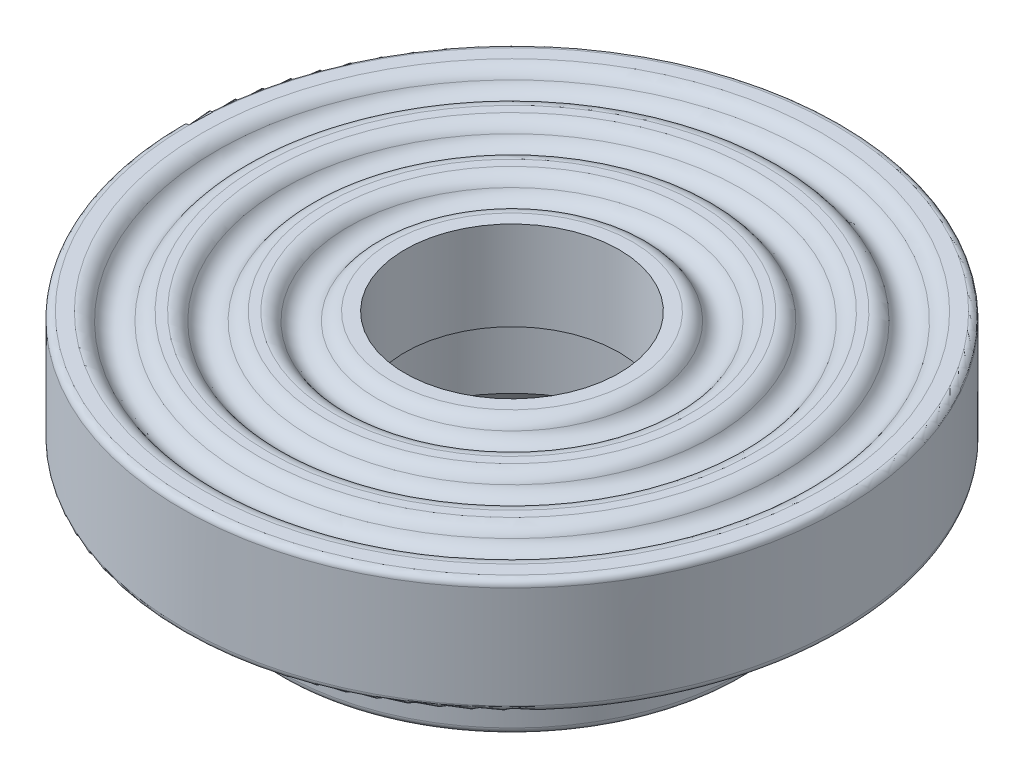
ISO-10303-21;
HEADER;
FILE_DESCRIPTION(('STEP AP214'),'2;1');
FILE_NAME('part.step','',(''),(''),'','','');
FILE_SCHEMA(('AUTOMOTIVE_DESIGN { 1 0 10303 214 1 1 1 1 }'));
ENDSEC;
DATA;
#1=APPLICATION_CONTEXT('core data for automotive mechanical design processes');
#2=APPLICATION_PROTOCOL_DEFINITION('international standard','automotive_design',2000,#1);
#3=PRODUCT_CONTEXT('',#1,'mechanical');
#4=PRODUCT('Part','Part','',(#3));
#5=PRODUCT_RELATED_PRODUCT_CATEGORY('part','',(#4));
#6=PRODUCT_DEFINITION_FORMATION('','',#4);
#7=PRODUCT_DEFINITION_CONTEXT('part definition',#1,'design');
#8=PRODUCT_DEFINITION('design','',#6,#7);
#9=PRODUCT_DEFINITION_SHAPE('','',#8);
#10=(LENGTH_UNIT() NAMED_UNIT(*) SI_UNIT(.MILLI.,.METRE.));
#11=(NAMED_UNIT(*) PLANE_ANGLE_UNIT() SI_UNIT($,.RADIAN.));
#12=(NAMED_UNIT(*) SI_UNIT($,.STERADIAN.) SOLID_ANGLE_UNIT());
#13=UNCERTAINTY_MEASURE_WITH_UNIT(LENGTH_MEASURE(1.E-05),#10,'distance_accuracy_value','');
#14=(GEOMETRIC_REPRESENTATION_CONTEXT(3) GLOBAL_UNCERTAINTY_ASSIGNED_CONTEXT((#13)) GLOBAL_UNIT_ASSIGNED_CONTEXT((#10,
#11,#12)) REPRESENTATION_CONTEXT('',''));
#15=CARTESIAN_POINT('',(0.,0.,0.));
#16=DIRECTION('',(0.,0.,1.));
#17=DIRECTION('',(1.,0.,0.));
#18=AXIS2_PLACEMENT_3D('',#15,#16,#17);
#19=CARTESIAN_POINT('',(0.,5.7,0.));
#20=DIRECTION('',(0.,-1.,0.));
#21=DIRECTION('',(0.,0.,-1.));
#22=AXIS2_PLACEMENT_3D('',#19,#20,#21);
#23=TOROIDAL_SURFACE('',#22,5.39102540378444,0.5);
#24=CARTESIAN_POINT('',(0.,6.2,0.));
#25=DIRECTION('',(0.,1.,0.));
#26=DIRECTION('',(0.,0.,-1.));
#27=AXIS2_PLACEMENT_3D('',#24,#25,#26);
#28=CIRCLE('',#27,5.39102540378444);
#29=CARTESIAN_POINT('',(0.,6.2,-5.39102540378444));
#30=VERTEX_POINT('',#29);
#31=CARTESIAN_POINT('',(0.,6.2,5.39102540378444));
#32=VERTEX_POINT('',#31);
#33=EDGE_CURVE('E91',#30,#32,#28,.T.);
#34=ORIENTED_EDGE('',*,*,#33,.T.);
#35=CARTESIAN_POINT('',(0.,6.2,0.));
#36=DIRECTION('',(0.,1.,0.));
#37=DIRECTION('',(0.,0.,1.));
#38=AXIS2_PLACEMENT_3D('',#35,#36,#37);
#39=CIRCLE('',#38,5.39102540378444);
#40=EDGE_CURVE('E94',#32,#30,#39,.T.);
#41=ORIENTED_EDGE('',*,*,#40,.T.);
#42=EDGE_LOOP('',(#34,#41));
#43=FACE_BOUND('',#42,.T.);
#44=CARTESIAN_POINT('',(0.,5.95,0.));
#45=DIRECTION('',(0.,-1.,0.));
#46=DIRECTION('',(0.,0.,-1.));
#47=AXIS2_PLACEMENT_3D('',#44,#45,#46);
#48=CIRCLE('',#47,4.95801270189222);
#49=CARTESIAN_POINT('',(0.,5.95,-4.95801270189222));
#50=VERTEX_POINT('',#49);
#51=EDGE_CURVE('E99',#50,#50,#48,.T.);
#52=ORIENTED_EDGE('',*,*,#51,.T.);
#53=EDGE_LOOP('',(#52));
#54=FACE_BOUND('',#53,.T.);
#55=ADVANCED_FACE('F17',(#43,#54),#23,.T.);
#56=CARTESIAN_POINT('',(-3.25,6.2,0.));
#57=DIRECTION('',(0.,-1.,0.));
#58=DIRECTION('',(0.,0.,-1.));
#59=AXIS2_PLACEMENT_3D('',#56,#57,#58);
#60=PLANE('',#59);
#61=CARTESIAN_POINT('',(0.,6.2,0.));
#62=DIRECTION('',(0.,-1.,0.));
#63=DIRECTION('',(0.,0.,1.));
#64=AXIS2_PLACEMENT_3D('',#61,#62,#63);
#65=CIRCLE('',#64,5.65897459621556);
#66=CARTESIAN_POINT('',(0.,6.2,5.65897459621556));
#67=VERTEX_POINT('',#66);
#68=CARTESIAN_POINT('',(0.,6.2,-5.65897459621556));
#69=VERTEX_POINT('',#68);
#70=EDGE_CURVE('E183',#67,#69,#65,.T.);
#71=ORIENTED_EDGE('',*,*,#70,.F.);
#72=CARTESIAN_POINT('',(0.,6.2,0.));
#73=DIRECTION('',(0.,-1.,0.));
#74=DIRECTION('',(0.,0.,-1.));
#75=AXIS2_PLACEMENT_3D('',#72,#73,#74);
#76=CIRCLE('',#75,5.65897459621556);
#77=EDGE_CURVE('E136',#69,#67,#76,.T.);
#78=ORIENTED_EDGE('',*,*,#77,.F.);
#79=EDGE_LOOP('',(#71,#78));
#80=FACE_BOUND('',#79,.T.);
#81=ORIENTED_EDGE('',*,*,#33,.F.);
#82=ORIENTED_EDGE('',*,*,#40,.F.);
#83=EDGE_LOOP('',(#81,#82));
#84=FACE_BOUND('',#83,.T.);
#85=ADVANCED_FACE('F96',(#80,#84),#60,.F.);
#86=CARTESIAN_POINT('',(0.,6.2,0.));
#87=DIRECTION('',(0.,-1.,0.));
#88=DIRECTION('',(0.,0.,-1.));
#89=AXIS2_PLACEMENT_3D('',#86,#87,#88);
#90=TOROIDAL_SURFACE('',#89,4.525,0.500000000000002);
#91=ORIENTED_EDGE('',*,*,#51,.F.);
#92=EDGE_LOOP('',(#91));
#93=FACE_BOUND('',#92,.T.);
#94=CARTESIAN_POINT('',(0.,5.95,0.));
#95=DIRECTION('',(0.,1.,0.));
#96=DIRECTION('',(0.,0.,1.));
#97=AXIS2_PLACEMENT_3D('',#94,#95,#96);
#98=CIRCLE('',#97,4.09198729810778);
#99=CARTESIAN_POINT('',(0.,5.95,4.09198729810778));
#100=VERTEX_POINT('',#99);
#101=EDGE_CURVE('E134',#100,#100,#98,.T.);
#102=ORIENTED_EDGE('',*,*,#101,.F.);
#103=EDGE_LOOP('',(#102));
#104=FACE_BOUND('',#103,.T.);
#105=ADVANCED_FACE('F121',(#93,#104),#90,.F.);
#106=CARTESIAN_POINT('',(0.,5.7,0.));
#107=DIRECTION('',(0.,1.,0.));
#108=DIRECTION('',(0.,0.,1.));
#109=AXIS2_PLACEMENT_3D('',#106,#107,#108);
#110=TOROIDAL_SURFACE('',#109,5.65897459621556,0.5);
#111=ORIENTED_EDGE('',*,*,#70,.T.);
#112=ORIENTED_EDGE('',*,*,#77,.T.);
#113=EDGE_LOOP('',(#111,#112));
#114=FACE_BOUND('',#113,.T.);
#115=CARTESIAN_POINT('',(0.,5.95,0.));
#116=DIRECTION('',(0.,-1.,0.));
#117=DIRECTION('',(0.,0.,-1.));
#118=AXIS2_PLACEMENT_3D('',#115,#116,#117);
#119=CIRCLE('',#118,6.09198729810778);
#120=CARTESIAN_POINT('',(0.,5.95,-6.09198729810778));
#121=VERTEX_POINT('',#120);
#122=EDGE_CURVE('E132',#121,#121,#119,.F.);
#123=ORIENTED_EDGE('',*,*,#122,.T.);
#124=EDGE_LOOP('',(#123));
#125=FACE_BOUND('',#124,.T.);
#126=ADVANCED_FACE('F109',(#114,#125),#110,.T.);
#127=CARTESIAN_POINT('',(0.,5.7,0.));
#128=DIRECTION('',(0.,1.,0.));
#129=DIRECTION('',(0.,0.,1.));
#130=AXIS2_PLACEMENT_3D('',#127,#128,#129);
#131=TOROIDAL_SURFACE('',#130,3.65897459621556,0.5);
#132=CARTESIAN_POINT('',(0.,6.2,0.));
#133=DIRECTION('',(0.,-1.,0.));
#134=DIRECTION('',(0.,0.,1.));
#135=AXIS2_PLACEMENT_3D('',#132,#133,#134);
#136=CIRCLE('',#135,3.65897459621556);
#137=CARTESIAN_POINT('',(0.,6.2,3.65897459621556));
#138=VERTEX_POINT('',#137);
#139=CARTESIAN_POINT('',(0.,6.2,-3.65897459621556));
#140=VERTEX_POINT('',#139);
#141=EDGE_CURVE('E469',#138,#140,#136,.T.);
#142=ORIENTED_EDGE('',*,*,#141,.T.);
#143=CARTESIAN_POINT('',(0.,6.2,0.));
#144=DIRECTION('',(0.,-1.,0.));
#145=DIRECTION('',(0.,0.,-1.));
#146=AXIS2_PLACEMENT_3D('',#143,#144,#145);
#147=CIRCLE('',#146,3.65897459621556);
#148=EDGE_CURVE('E478',#140,#138,#147,.T.);
#149=ORIENTED_EDGE('',*,*,#148,.T.);
#150=EDGE_LOOP('',(#142,#149));
#151=FACE_BOUND('',#150,.T.);
#152=ORIENTED_EDGE('',*,*,#101,.T.);
#153=EDGE_LOOP('',(#152));
#154=FACE_BOUND('',#153,.T.);
#155=ADVANCED_FACE('F120',(#151,#154),#131,.T.);
#156=CARTESIAN_POINT('',(0.,6.2,0.));
#157=DIRECTION('',(0.,-1.,0.));
#158=DIRECTION('',(0.,0.,-1.));
#159=AXIS2_PLACEMENT_3D('',#156,#157,#158);
#160=TOROIDAL_SURFACE('',#159,6.525,0.500000000000001);
#161=CARTESIAN_POINT('',(0.,5.95,0.));
#162=DIRECTION('',(0.,-1.,0.));
#163=DIRECTION('',(0.,0.,-1.));
#164=AXIS2_PLACEMENT_3D('',#161,#162,#163);
#165=CIRCLE('',#164,6.95801270189222);
#166=CARTESIAN_POINT('',(0.,5.95,-6.95801270189222));
#167=VERTEX_POINT('',#166);
#168=EDGE_CURVE('E213',#167,#167,#165,.T.);
#169=ORIENTED_EDGE('',*,*,#168,.F.);
#170=EDGE_LOOP('',(#169));
#171=FACE_BOUND('',#170,.T.);
#172=ORIENTED_EDGE('',*,*,#122,.F.);
#173=EDGE_LOOP('',(#172));
#174=FACE_BOUND('',#173,.T.);
#175=ADVANCED_FACE('F485',(#171,#174),#160,.F.);
#176=CARTESIAN_POINT('',(-3.25,6.2,0.));
#177=DIRECTION('',(0.,-1.,0.));
#178=DIRECTION('',(0.,0.,-1.));
#179=AXIS2_PLACEMENT_3D('',#176,#177,#178);
#180=PLANE('',#179);
#181=CARTESIAN_POINT('',(0.,6.2,0.));
#182=DIRECTION('',(0.,-1.,0.));
#183=DIRECTION('',(0.,0.,-1.));
#184=AXIS2_PLACEMENT_3D('',#181,#182,#183);
#185=CIRCLE('',#184,3.25);
#186=CARTESIAN_POINT('',(0.,6.2,-3.25));
#187=VERTEX_POINT('',#186);
#188=EDGE_CURVE('E209',#187,#187,#185,.T.);
#189=ORIENTED_EDGE('',*,*,#188,.T.);
#190=EDGE_LOOP('',(#189));
#191=FACE_BOUND('',#190,.T.);
#192=ORIENTED_EDGE('',*,*,#141,.F.);
#193=ORIENTED_EDGE('',*,*,#148,.F.);
#194=EDGE_LOOP('',(#192,#193));
#195=FACE_BOUND('',#194,.T.);
#196=ADVANCED_FACE('F449',(#191,#195),#180,.F.);
#197=CARTESIAN_POINT('',(0.,5.7,0.));
#198=DIRECTION('',(0.,-1.,0.));
#199=DIRECTION('',(0.,0.,-1.));
#200=AXIS2_PLACEMENT_3D('',#197,#198,#199);
#201=TOROIDAL_SURFACE('',#200,7.39102540378444,0.5);
#202=CARTESIAN_POINT('',(0.,6.2,0.));
#203=DIRECTION('',(0.,1.,0.));
#204=DIRECTION('',(0.,0.,-1.));
#205=AXIS2_PLACEMENT_3D('',#202,#203,#204);
#206=CIRCLE('',#205,7.39102540378444);
#207=CARTESIAN_POINT('',(0.,6.2,-7.39102540378444));
#208=VERTEX_POINT('',#207);
#209=CARTESIAN_POINT('',(0.,6.2,7.39102540378444));
#210=VERTEX_POINT('',#209);
#211=EDGE_CURVE('E212',#208,#210,#206,.T.);
#212=ORIENTED_EDGE('',*,*,#211,.T.);
#213=CARTESIAN_POINT('',(0.,6.2,0.));
#214=DIRECTION('',(0.,1.,0.));
#215=DIRECTION('',(0.,0.,1.));
#216=AXIS2_PLACEMENT_3D('',#213,#214,#215);
#217=CIRCLE('',#216,7.39102540378444);
#218=EDGE_CURVE('E208',#210,#208,#217,.T.);
#219=ORIENTED_EDGE('',*,*,#218,.T.);
#220=EDGE_LOOP('',(#212,#219));
#221=FACE_BOUND('',#220,.T.);
#222=ORIENTED_EDGE('',*,*,#168,.T.);
#223=EDGE_LOOP('',(#222));
#224=FACE_BOUND('',#223,.T.);
#225=ADVANCED_FACE('F445',(#221,#224),#201,.T.);
#226=CARTESIAN_POINT('',(0.,0.,0.));
#227=DIRECTION('',(0.,-1.,0.));
#228=DIRECTION('',(0.,0.,-1.));
#229=AXIS2_PLACEMENT_3D('',#226,#227,#228);
#230=CYLINDRICAL_SURFACE('',#229,3.25);
#231=ORIENTED_EDGE('',*,*,#188,.F.);
#232=EDGE_LOOP('',(#231));
#233=FACE_BOUND('',#232,.T.);
#234=CARTESIAN_POINT('',(0.,3.5,0.));
#235=DIRECTION('',(0.,-1.,0.));
#236=DIRECTION('',(0.,0.,-1.));
#237=AXIS2_PLACEMENT_3D('',#234,#235,#236);
#238=CIRCLE('',#237,3.25);
#239=CARTESIAN_POINT('',(0.,3.5,-3.25));
#240=VERTEX_POINT('',#239);
#241=EDGE_CURVE('E204',#240,#240,#238,.T.);
#242=ORIENTED_EDGE('',*,*,#241,.T.);
#243=EDGE_LOOP('',(#242));
#244=FACE_BOUND('',#243,.T.);
#245=ADVANCED_FACE('F405',(#233,#244),#230,.F.);
#246=CARTESIAN_POINT('',(-3.25,6.2,0.));
#247=DIRECTION('',(0.,-1.,0.));
#248=DIRECTION('',(0.,0.,-1.));
#249=AXIS2_PLACEMENT_3D('',#246,#247,#248);
#250=PLANE('',#249);
#251=CARTESIAN_POINT('',(0.,6.2,0.));
#252=DIRECTION('',(0.,-1.,0.));
#253=DIRECTION('',(0.,0.,1.));
#254=AXIS2_PLACEMENT_3D('',#251,#252,#253);
#255=CIRCLE('',#254,7.65897459621556);
#256=CARTESIAN_POINT('',(0.,6.2,7.65897459621556));
#257=VERTEX_POINT('',#256);
#258=CARTESIAN_POINT('',(0.,6.2,-7.65897459621556));
#259=VERTEX_POINT('',#258);
#260=EDGE_CURVE('E207',#257,#259,#255,.T.);
#261=ORIENTED_EDGE('',*,*,#260,.F.);
#262=CARTESIAN_POINT('',(0.,6.2,0.));
#263=DIRECTION('',(0.,-1.,0.));
#264=DIRECTION('',(0.,0.,-1.));
#265=AXIS2_PLACEMENT_3D('',#262,#263,#264);
#266=CIRCLE('',#265,7.65897459621556);
#267=EDGE_CURVE('E203',#259,#257,#266,.T.);
#268=ORIENTED_EDGE('',*,*,#267,.F.);
#269=EDGE_LOOP('',(#261,#268));
#270=FACE_BOUND('',#269,.T.);
#271=ORIENTED_EDGE('',*,*,#211,.F.);
#272=ORIENTED_EDGE('',*,*,#218,.F.);
#273=EDGE_LOOP('',(#271,#272));
#274=FACE_BOUND('',#273,.T.);
#275=ADVANCED_FACE('F396',(#270,#274),#250,.F.);
#276=CARTESIAN_POINT('',(-4.5,3.5,0.));
#277=DIRECTION('',(0.,1.,0.));
#278=DIRECTION('',(0.,0.,1.));
#279=AXIS2_PLACEMENT_3D('',#276,#277,#278);
#280=PLANE('',#279);
#281=CARTESIAN_POINT('',(0.,3.5,0.));
#282=DIRECTION('',(0.,-1.,0.));
#283=DIRECTION('',(0.,0.,-1.));
#284=AXIS2_PLACEMENT_3D('',#281,#282,#283);
#285=CIRCLE('',#284,4.5);
#286=CARTESIAN_POINT('',(0.,3.5,-4.5));
#287=VERTEX_POINT('',#286);
#288=EDGE_CURVE('E199',#287,#287,#285,.T.);
#289=ORIENTED_EDGE('',*,*,#288,.T.);
#290=EDGE_LOOP('',(#289));
#291=FACE_BOUND('',#290,.T.);
#292=ORIENTED_EDGE('',*,*,#241,.F.);
#293=EDGE_LOOP('',(#292));
#294=FACE_BOUND('',#293,.T.);
#295=ADVANCED_FACE('F381',(#291,#294),#280,.F.);
#296=CARTESIAN_POINT('',(0.,5.7,0.));
#297=DIRECTION('',(0.,1.,0.));
#298=DIRECTION('',(0.,0.,1.));
#299=AXIS2_PLACEMENT_3D('',#296,#297,#298);
#300=TOROIDAL_SURFACE('',#299,7.65897459621556,0.5);
#301=ORIENTED_EDGE('',*,*,#260,.T.);
#302=ORIENTED_EDGE('',*,*,#267,.T.);
#303=EDGE_LOOP('',(#301,#302));
#304=FACE_BOUND('',#303,.T.);
#305=CARTESIAN_POINT('',(0.,5.95,0.));
#306=DIRECTION('',(0.,-1.,0.));
#307=DIRECTION('',(0.,0.,-1.));
#308=AXIS2_PLACEMENT_3D('',#305,#306,#307);
#309=CIRCLE('',#308,8.09198729810778);
#310=CARTESIAN_POINT('',(0.,5.95,-8.09198729810778));
#311=VERTEX_POINT('',#310);
#312=EDGE_CURVE('E202',#311,#311,#309,.F.);
#313=ORIENTED_EDGE('',*,*,#312,.T.);
#314=EDGE_LOOP('',(#313));
#315=FACE_BOUND('',#314,.T.);
#316=ADVANCED_FACE('F375',(#304,#315),#300,.T.);
#317=CARTESIAN_POINT('',(0.,0.,0.));
#318=DIRECTION('',(0.,-1.,0.));
#319=DIRECTION('',(0.,0.,-1.));
#320=AXIS2_PLACEMENT_3D('',#317,#318,#319);
#321=CYLINDRICAL_SURFACE('',#320,4.5);
#322=CARTESIAN_POINT('',(0.,0.86602540380909,0.));
#323=DIRECTION('',(0.,-1.,0.));
#324=DIRECTION('',(0.,0.,-1.));
#325=AXIS2_PLACEMENT_3D('',#322,#323,#324);
#326=CIRCLE('',#325,4.50000000000728);
#327=CARTESIAN_POINT('',(0.,0.86602540380909,-4.50000000000728));
#328=VERTEX_POINT('',#327);
#329=EDGE_CURVE('E364',#328,#328,#326,.T.);
#330=ORIENTED_EDGE('',*,*,#329,.T.);
#331=EDGE_LOOP('',(#330));
#332=FACE_BOUND('',#331,.T.);
#333=ORIENTED_EDGE('',*,*,#288,.F.);
#334=EDGE_LOOP('',(#333));
#335=FACE_BOUND('',#334,.T.);
#336=ADVANCED_FACE('F371',(#332,#335),#321,.F.);
#337=CARTESIAN_POINT('',(0.,6.2,0.));
#338=DIRECTION('',(0.,-1.,0.));
#339=DIRECTION('',(0.,0.,-1.));
#340=AXIS2_PLACEMENT_3D('',#337,#338,#339);
#341=TOROIDAL_SURFACE('',#340,8.525,0.500000000000001);
#342=CARTESIAN_POINT('',(0.,5.94999999999999,0.));
#343=DIRECTION('',(0.,-1.,0.));
#344=DIRECTION('',(0.,0.,-1.));
#345=AXIS2_PLACEMENT_3D('',#342,#343,#344);
#346=CIRCLE('',#345,8.95801270189222);
#347=CARTESIAN_POINT('',(0.,5.94999999999999,-8.95801270189222));
#348=VERTEX_POINT('',#347);
#349=EDGE_CURVE('E198',#348,#348,#346,.T.);
#350=ORIENTED_EDGE('',*,*,#349,.F.);
#351=EDGE_LOOP('',(#350));
#352=FACE_BOUND('',#351,.T.);
#353=ORIENTED_EDGE('',*,*,#312,.F.);
#354=EDGE_LOOP('',(#353));
#355=FACE_BOUND('',#354,.T.);
#356=ADVANCED_FACE('F368',(#352,#355),#341,.F.);
#357=CARTESIAN_POINT('',(0.,0.,0.));
#358=DIRECTION('',(0.,-1.,0.));
#359=DIRECTION('',(0.,0.,-1.));
#360=AXIS2_PLACEMENT_3D('',#357,#358,#359);
#361=CONICAL_SURFACE('',#360,4.99999999999545,0.523598775575734);
#362=CARTESIAN_POINT('',(0.,0.,0.));
#363=DIRECTION('',(0.,-1.,0.));
#364=DIRECTION('',(0.,0.,-1.));
#365=AXIS2_PLACEMENT_3D('',#362,#363,#364);
#366=CIRCLE('',#365,4.99999999999545);
#367=CARTESIAN_POINT('',(0.,0.,-4.99999999999545));
#368=VERTEX_POINT('',#367);
#369=EDGE_CURVE('E189',#368,#368,#366,.T.);
#370=ORIENTED_EDGE('',*,*,#369,.T.);
#371=EDGE_LOOP('',(#370));
#372=FACE_BOUND('',#371,.T.);
#373=ORIENTED_EDGE('',*,*,#329,.F.);
#374=EDGE_LOOP('',(#373));
#375=FACE_BOUND('',#374,.T.);
#376=ADVANCED_FACE('F342',(#372,#375),#361,.F.);
#377=CARTESIAN_POINT('',(0.,5.7,0.));
#378=DIRECTION('',(0.,-1.,0.));
#379=DIRECTION('',(0.,0.,-1.));
#380=AXIS2_PLACEMENT_3D('',#377,#378,#379);
#381=TOROIDAL_SURFACE('',#380,9.39102540378444,0.5);
#382=CARTESIAN_POINT('',(0.,6.2,0.));
#383=DIRECTION('',(0.,1.,0.));
#384=DIRECTION('',(0.,0.,-1.));
#385=AXIS2_PLACEMENT_3D('',#382,#383,#384);
#386=CIRCLE('',#385,9.39102540378444);
#387=CARTESIAN_POINT('',(0.,6.2,-9.39102540378444));
#388=VERTEX_POINT('',#387);
#389=CARTESIAN_POINT('',(0.,6.2,9.39102540378444));
#390=VERTEX_POINT('',#389);
#391=EDGE_CURVE('E197',#388,#390,#386,.T.);
#392=ORIENTED_EDGE('',*,*,#391,.T.);
#393=CARTESIAN_POINT('',(0.,6.2,0.));
#394=DIRECTION('',(0.,1.,0.));
#395=DIRECTION('',(0.,0.,1.));
#396=AXIS2_PLACEMENT_3D('',#393,#394,#395);
#397=CIRCLE('',#396,9.39102540378444);
#398=EDGE_CURVE('E353',#390,#388,#397,.T.);
#399=ORIENTED_EDGE('',*,*,#398,.T.);
#400=EDGE_LOOP('',(#392,#399));
#401=FACE_BOUND('',#400,.T.);
#402=ORIENTED_EDGE('',*,*,#349,.T.);
#403=EDGE_LOOP('',(#402));
#404=FACE_BOUND('',#403,.T.);
#405=ADVANCED_FACE('F330',(#401,#404),#381,.T.);
#406=CARTESIAN_POINT('',(-7.,0.,0.));
#407=DIRECTION('',(0.,1.,0.));
#408=DIRECTION('',(0.,0.,1.));
#409=AXIS2_PLACEMENT_3D('',#406,#407,#408);
#410=PLANE('',#409);
#411=CARTESIAN_POINT('',(0.,0.,0.));
#412=DIRECTION('',(0.,1.,0.));
#413=DIRECTION('',(0.,0.,1.));
#414=AXIS2_PLACEMENT_3D('',#411,#412,#413);
#415=CIRCLE('',#414,6.8);
#416=CARTESIAN_POINT('',(0.,0.,6.8));
#417=VERTEX_POINT('',#416);
#418=CARTESIAN_POINT('',(0.,0.,-6.8));
#419=VERTEX_POINT('',#418);
#420=EDGE_CURVE('E545',#417,#419,#415,.T.);
#421=ORIENTED_EDGE('',*,*,#420,.F.);
#422=CARTESIAN_POINT('',(0.,0.,0.));
#423=DIRECTION('',(0.,1.,0.));
#424=DIRECTION('',(0.,0.,-1.));
#425=AXIS2_PLACEMENT_3D('',#422,#423,#424);
#426=CIRCLE('',#425,6.8);
#427=EDGE_CURVE('E311',#419,#417,#426,.T.);
#428=ORIENTED_EDGE('',*,*,#427,.F.);
#429=EDGE_LOOP('',(#421,#428));
#430=FACE_BOUND('',#429,.T.);
#431=ORIENTED_EDGE('',*,*,#369,.F.);
#432=EDGE_LOOP('',(#431));
#433=FACE_BOUND('',#432,.T.);
#434=ADVANCED_FACE('F341',(#430,#433),#410,.F.);
#435=CARTESIAN_POINT('',(-3.25,6.2,0.));
#436=DIRECTION('',(0.,-1.,0.));
#437=DIRECTION('',(0.,0.,-1.));
#438=AXIS2_PLACEMENT_3D('',#435,#436,#437);
#439=PLANE('',#438);
#440=CARTESIAN_POINT('',(0.,6.2,0.));
#441=DIRECTION('',(0.,-1.,0.));
#442=DIRECTION('',(0.,0.,-1.));
#443=AXIS2_PLACEMENT_3D('',#440,#441,#442);
#444=CIRCLE('',#443,9.8);
#445=CARTESIAN_POINT('',(0.,6.2,-9.8));
#446=VERTEX_POINT('',#445);
#447=CARTESIAN_POINT('',(0.,6.2,9.8));
#448=VERTEX_POINT('',#447);
#449=EDGE_CURVE('E542',#446,#448,#444,.T.);
#450=ORIENTED_EDGE('',*,*,#449,.F.);
#451=CARTESIAN_POINT('',(0.,6.2,0.));
#452=DIRECTION('',(0.,-1.,0.));
#453=DIRECTION('',(0.,0.,1.));
#454=AXIS2_PLACEMENT_3D('',#451,#452,#453);
#455=CIRCLE('',#454,9.8);
#456=EDGE_CURVE('E541',#448,#446,#455,.T.);
#457=ORIENTED_EDGE('',*,*,#456,.F.);
#458=EDGE_LOOP('',(#450,#457));
#459=FACE_BOUND('',#458,.T.);
#460=ORIENTED_EDGE('',*,*,#391,.F.);
#461=ORIENTED_EDGE('',*,*,#398,.F.);
#462=EDGE_LOOP('',(#460,#461));
#463=FACE_BOUND('',#462,.T.);
#464=ADVANCED_FACE('F566',(#459,#463),#439,.F.);
#465=CARTESIAN_POINT('',(0.,0.2,0.));
#466=DIRECTION('',(0.,1.,0.));
#467=DIRECTION('',(0.,0.,1.));
#468=AXIS2_PLACEMENT_3D('',#465,#466,#467);
#469=TOROIDAL_SURFACE('',#468,6.8,0.2);
#470=CARTESIAN_POINT('',(0.,0.2,0.));
#471=DIRECTION('',(0.,-1.,0.));
#472=DIRECTION('',(0.,0.,-1.));
#473=AXIS2_PLACEMENT_3D('',#470,#471,#472);
#474=CIRCLE('',#473,7.);
#475=CARTESIAN_POINT('',(0.,0.2,-7.));
#476=VERTEX_POINT('',#475);
#477=EDGE_CURVE('E277',#476,#476,#474,.F.);
#478=ORIENTED_EDGE('',*,*,#477,.F.);
#479=EDGE_LOOP('',(#478));
#480=FACE_BOUND('',#479,.T.);
#481=ORIENTED_EDGE('',*,*,#420,.T.);
#482=ORIENTED_EDGE('',*,*,#427,.T.);
#483=EDGE_LOOP('',(#481,#482));
#484=FACE_BOUND('',#483,.T.);
#485=ADVANCED_FACE('F288',(#480,#484),#469,.T.);
#486=CARTESIAN_POINT('',(0.,6.,0.));
#487=DIRECTION('',(0.,-1.,0.));
#488=DIRECTION('',(0.,0.,-1.));
#489=AXIS2_PLACEMENT_3D('',#486,#487,#488);
#490=TOROIDAL_SURFACE('',#489,9.8,0.2);
#491=ORIENTED_EDGE('',*,*,#449,.T.);
#492=ORIENTED_EDGE('',*,*,#456,.T.);
#493=EDGE_LOOP('',(#491,#492));
#494=FACE_BOUND('',#493,.T.);
#495=CARTESIAN_POINT('',(0.,6.,0.));
#496=DIRECTION('',(0.,-1.,0.));
#497=DIRECTION('',(0.,0.,-1.));
#498=AXIS2_PLACEMENT_3D('',#495,#496,#497);
#499=CIRCLE('',#498,10.);
#500=CARTESIAN_POINT('',(0.,6.,-10.));
#501=VERTEX_POINT('',#500);
#502=EDGE_CURVE('E274',#501,#501,#499,.T.);
#503=ORIENTED_EDGE('',*,*,#502,.F.);
#504=EDGE_LOOP('',(#503));
#505=FACE_BOUND('',#504,.T.);
#506=ADVANCED_FACE('F282',(#494,#505),#490,.T.);
#507=CARTESIAN_POINT('',(0.,0.,0.));
#508=DIRECTION('',(0.,-1.,0.));
#509=DIRECTION('',(0.,0.,-1.));
#510=AXIS2_PLACEMENT_3D('',#507,#508,#509);
#511=CYLINDRICAL_SURFACE('',#510,7.);
#512=ORIENTED_EDGE('',*,*,#477,.T.);
#513=EDGE_LOOP('',(#512));
#514=FACE_BOUND('',#513,.T.);
#515=CARTESIAN_POINT('',(0.,2.5,0.));
#516=DIRECTION('',(0.,1.,0.));
#517=DIRECTION('',(0.,0.,1.));
#518=AXIS2_PLACEMENT_3D('',#515,#516,#517);
#519=CIRCLE('',#518,7.);
#520=CARTESIAN_POINT('',(0.,2.5,7.));
#521=VERTEX_POINT('',#520);
#522=EDGE_CURVE('E271',#521,#521,#519,.F.);
#523=ORIENTED_EDGE('',*,*,#522,.T.);
#524=EDGE_LOOP('',(#523));
#525=FACE_BOUND('',#524,.T.);
#526=ADVANCED_FACE('F287',(#514,#525),#511,.T.);
#527=CARTESIAN_POINT('',(0.,0.,0.));
#528=DIRECTION('',(0.,-1.,0.));
#529=DIRECTION('',(0.,0.,-1.));
#530=AXIS2_PLACEMENT_3D('',#527,#528,#529);
#531=CYLINDRICAL_SURFACE('',#530,10.);
#532=ORIENTED_EDGE('',*,*,#502,.T.);
#533=EDGE_LOOP('',(#532));
#534=FACE_BOUND('',#533,.T.);
#535=CARTESIAN_POINT('',(0.,2.9,0.));
#536=DIRECTION('',(0.,1.,0.));
#537=DIRECTION('',(0.,0.,1.));
#538=AXIS2_PLACEMENT_3D('',#535,#536,#537);
#539=CIRCLE('',#538,10.);
#540=CARTESIAN_POINT('',(0.,2.9,10.));
#541=VERTEX_POINT('',#540);
#542=EDGE_CURVE('E262',#541,#541,#539,.F.);
#543=ORIENTED_EDGE('',*,*,#542,.F.);
#544=EDGE_LOOP('',(#543));
#545=FACE_BOUND('',#544,.T.);
#546=ADVANCED_FACE('F529',(#534,#545),#531,.T.);
#547=CARTESIAN_POINT('',(0.,2.5,0.));
#548=DIRECTION('',(0.,1.,0.));
#549=DIRECTION('',(0.,0.,1.));
#550=AXIS2_PLACEMENT_3D('',#547,#548,#549);
#551=TOROIDAL_SURFACE('',#550,7.2,0.2);
#552=CARTESIAN_POINT('',(0.,2.7,0.));
#553=DIRECTION('',(0.,-1.,0.));
#554=DIRECTION('',(0.,0.,-1.));
#555=AXIS2_PLACEMENT_3D('',#552,#553,#554);
#556=CIRCLE('',#555,7.2);
#557=CARTESIAN_POINT('',(0.,2.7,-7.2));
#558=VERTEX_POINT('',#557);
#559=CARTESIAN_POINT('',(0.,2.7,7.2));
#560=VERTEX_POINT('',#559);
#561=EDGE_CURVE('E258',#558,#560,#556,.T.);
#562=ORIENTED_EDGE('',*,*,#561,.T.);
#563=CARTESIAN_POINT('',(0.,2.7,0.));
#564=DIRECTION('',(0.,-1.,0.));
#565=DIRECTION('',(0.,0.,1.));
#566=AXIS2_PLACEMENT_3D('',#563,#564,#565);
#567=CIRCLE('',#566,7.2);
#568=EDGE_CURVE('E270',#560,#558,#567,.T.);
#569=ORIENTED_EDGE('',*,*,#568,.T.);
#570=EDGE_LOOP('',(#562,#569));
#571=FACE_BOUND('',#570,.T.);
#572=ORIENTED_EDGE('',*,*,#522,.F.);
#573=EDGE_LOOP('',(#572));
#574=FACE_BOUND('',#573,.T.);
#575=ADVANCED_FACE('F234',(#571,#574),#551,.F.);
#576=CARTESIAN_POINT('',(0.,2.9,0.));
#577=DIRECTION('',(0.,1.,0.));
#578=DIRECTION('',(0.,0.,1.));
#579=AXIS2_PLACEMENT_3D('',#576,#577,#578);
#580=TOROIDAL_SURFACE('',#579,9.8,0.2);
#581=CARTESIAN_POINT('',(0.,2.7,0.));
#582=DIRECTION('',(0.,1.,0.));
#583=DIRECTION('',(0.,0.,1.));
#584=AXIS2_PLACEMENT_3D('',#581,#582,#583);
#585=CIRCLE('',#584,9.8);
#586=CARTESIAN_POINT('',(0.,2.7,9.8));
#587=VERTEX_POINT('',#586);
#588=CARTESIAN_POINT('',(0.,2.7,-9.8));
#589=VERTEX_POINT('',#588);
#590=EDGE_CURVE('E29',#587,#589,#585,.T.);
#591=ORIENTED_EDGE('',*,*,#590,.T.);
#592=CARTESIAN_POINT('',(0.,2.7,0.));
#593=DIRECTION('',(0.,1.,0.));
#594=DIRECTION('',(0.,0.,-1.));
#595=AXIS2_PLACEMENT_3D('',#592,#593,#594);
#596=CIRCLE('',#595,9.8);
#597=EDGE_CURVE('E11',#589,#587,#596,.T.);
#598=ORIENTED_EDGE('',*,*,#597,.T.);
#599=EDGE_LOOP('',(#591,#598));
#600=FACE_BOUND('',#599,.T.);
#601=ORIENTED_EDGE('',*,*,#542,.T.);
#602=EDGE_LOOP('',(#601));
#603=FACE_BOUND('',#602,.T.);
#604=ADVANCED_FACE('F222',(#600,#603),#580,.T.);
#605=CARTESIAN_POINT('',(-10.,2.7,0.));
#606=DIRECTION('',(0.,1.,0.));
#607=DIRECTION('',(0.,0.,1.));
#608=AXIS2_PLACEMENT_3D('',#605,#606,#607);
#609=PLANE('',#608);
#610=ORIENTED_EDGE('',*,*,#590,.F.);
#611=ORIENTED_EDGE('',*,*,#597,.F.);
#612=EDGE_LOOP('',(#610,#611));
#613=FACE_BOUND('',#612,.T.);
#614=ORIENTED_EDGE('',*,*,#568,.F.);
#615=ORIENTED_EDGE('',*,*,#561,.F.);
#616=EDGE_LOOP('',(#614,#615));
#617=FACE_BOUND('',#616,.T.);
#618=ADVANCED_FACE('F233',(#613,#617),#609,.F.);
#619=CLOSED_SHELL('',(#55,#85,#105,#126,#155,#175,#196,#225,#245,#275,#295,#316,#336,#356,#376,
#405,#434,#464,#485,#506,#526,#546,#575,#604,#618));
#620=MANIFOLD_SOLID_BREP('B1',#619);
#621=ADVANCED_BREP_SHAPE_REPRESENTATION('',(#18,#620),#14);
#622=SHAPE_DEFINITION_REPRESENTATION(#9,#621);
ENDSEC;
END-ISO-10303-21;
